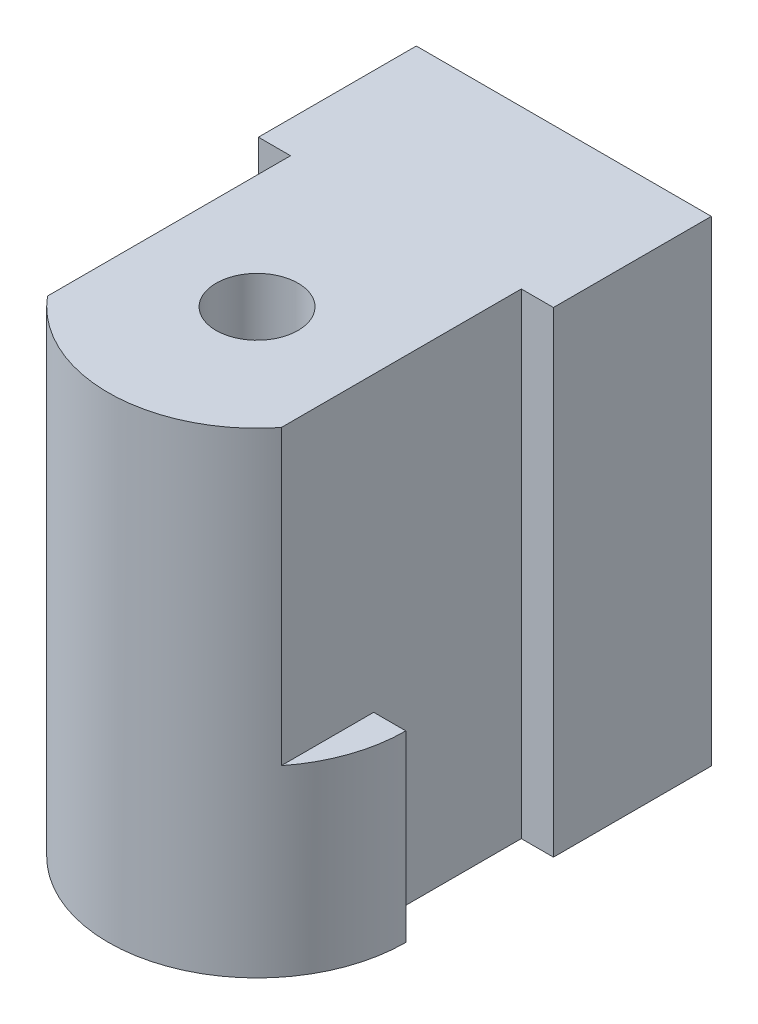
ISO-10303-21;
HEADER;
FILE_DESCRIPTION(('STEP AP214'),'2;1');
FILE_NAME('part.step','',(''),(''),'','','');
FILE_SCHEMA(('AUTOMOTIVE_DESIGN { 1 0 10303 214 1 1 1 1 }'));
ENDSEC;
DATA;
#1=APPLICATION_CONTEXT('core data for automotive mechanical design processes');
#2=APPLICATION_PROTOCOL_DEFINITION('international standard','automotive_design',2000,#1);
#3=PRODUCT_CONTEXT('',#1,'mechanical');
#4=PRODUCT('Part','Part','',(#3));
#5=PRODUCT_RELATED_PRODUCT_CATEGORY('part','',(#4));
#6=PRODUCT_DEFINITION_FORMATION('','',#4);
#7=PRODUCT_DEFINITION_CONTEXT('part definition',#1,'design');
#8=PRODUCT_DEFINITION('design','',#6,#7);
#9=PRODUCT_DEFINITION_SHAPE('','',#8);
#10=(LENGTH_UNIT() NAMED_UNIT(*) SI_UNIT(.MILLI.,.METRE.));
#11=(NAMED_UNIT(*) PLANE_ANGLE_UNIT() SI_UNIT($,.RADIAN.));
#12=(NAMED_UNIT(*) SI_UNIT($,.STERADIAN.) SOLID_ANGLE_UNIT());
#13=UNCERTAINTY_MEASURE_WITH_UNIT(LENGTH_MEASURE(1.E-05),#10,'distance_accuracy_value','');
#14=(GEOMETRIC_REPRESENTATION_CONTEXT(3) GLOBAL_UNCERTAINTY_ASSIGNED_CONTEXT((#13)) GLOBAL_UNIT_ASSIGNED_CONTEXT((#10,
#11,#12)) REPRESENTATION_CONTEXT('',''));
#15=CARTESIAN_POINT('',(0.,0.,0.));
#16=DIRECTION('',(0.,0.,1.));
#17=DIRECTION('',(1.,0.,0.));
#18=AXIS2_PLACEMENT_3D('',#15,#16,#17);
#19=CARTESIAN_POINT('',(-53.6939675410073,-2070.74992623645,-163.840329353942));
#20=DIRECTION('',(0.,-1.,0.));
#21=DIRECTION('',(1.,0.,0.));
#22=AXIS2_PLACEMENT_3D('',#19,#20,#21);
#23=CYLINDRICAL_SURFACE('',#22,12.7);
#24=CARTESIAN_POINT('',(-53.6939675410073,-2070.74992623645,-163.840329353942));
#25=DIRECTION('',(0.,1.,0.));
#26=DIRECTION('',(-1.,0.,0.));
#27=AXIS2_PLACEMENT_3D('',#24,#25,#26);
#28=CIRCLE('',#27,12.7);
#29=CARTESIAN_POINT('',(-63.4359075539626,-2070.74992623645,-155.692654545509));
#30=VERTEX_POINT('',#29);
#31=CARTESIAN_POINT('',(-43.7377214399227,-2070.74992623645,-155.955967390243));
#32=VERTEX_POINT('',#31);
#33=EDGE_CURVE('E285',#30,#32,#28,.T.);
#34=ORIENTED_EDGE('',*,*,#33,.F.);
#35=DIRECTION('',(0.,-1.,0.));
#36=VECTOR('',#35,1.);
#37=CARTESIAN_POINT('',(-63.4359075539626,-2070.74992623645,-155.692654545509));
#38=LINE('',#37,#36);
#39=CARTESIAN_POINT('',(-63.4359075539626,-2095.74992623645,-155.692654545509));
#40=VERTEX_POINT('',#39);
#41=EDGE_CURVE('E181',#30,#40,#38,.T.);
#42=ORIENTED_EDGE('',*,*,#41,.T.);
#43=CARTESIAN_POINT('',(-53.6939675410073,-2095.74992623645,-163.840329353942));
#44=DIRECTION('',(0.,1.,0.));
#45=DIRECTION('',(0.,0.,1.));
#46=AXIS2_PLACEMENT_3D('',#43,#44,#45);
#47=CIRCLE('',#46,12.7);
#48=CARTESIAN_POINT('',(-66.179661452878,-2095.74992623645,-166.163570094605));
#49=VERTEX_POINT('',#48);
#50=EDGE_CURVE('E177',#49,#40,#47,.T.);
#51=ORIENTED_EDGE('',*,*,#50,.F.);
#52=DIRECTION('',(0.,-1.,0.));
#53=VECTOR('',#52,1.);
#54=CARTESIAN_POINT('',(-66.179661452878,-2101.38992623645,-166.163570094605));
#55=LINE('',#54,#53);
#56=CARTESIAN_POINT('',(-66.179661452878,-2111.38992623645,-166.163570094605));
#57=VERTEX_POINT('',#56);
#58=EDGE_CURVE('E255',#49,#57,#55,.T.);
#59=ORIENTED_EDGE('',*,*,#58,.T.);
#60=CARTESIAN_POINT('',(-53.6939675410073,-2111.38992623645,-163.840329353942));
#61=DIRECTION('',(0.,1.,0.));
#62=DIRECTION('',(-1.,0.,0.));
#63=AXIS2_PLACEMENT_3D('',#60,#61,#62);
#64=CIRCLE('',#63,12.7);
#65=CARTESIAN_POINT('',(-40.9939675410073,-2111.38992623645,-163.840329353942));
#66=VERTEX_POINT('',#65);
#67=EDGE_CURVE('E284',#57,#66,#64,.T.);
#68=ORIENTED_EDGE('',*,*,#67,.T.);
#69=DIRECTION('',(0.,-1.,0.));
#70=VECTOR('',#69,1.);
#71=CARTESIAN_POINT('',(-40.9939675410073,-2101.38992623645,-163.840329353942));
#72=LINE('',#71,#70);
#73=CARTESIAN_POINT('',(-40.9939675410073,-2095.74992623645,-163.840329353942));
#74=VERTEX_POINT('',#73);
#75=EDGE_CURVE('E256',#74,#66,#72,.T.);
#76=ORIENTED_EDGE('',*,*,#75,.F.);
#77=CARTESIAN_POINT('',(-53.6939675410073,-2095.74992623645,-163.840329353942));
#78=DIRECTION('',(0.,-1.,0.));
#79=DIRECTION('',(0.,0.,-1.));
#80=AXIS2_PLACEMENT_3D('',#77,#78,#79);
#81=CIRCLE('',#80,12.7);
#82=CARTESIAN_POINT('',(-43.7377214399227,-2095.74992623645,-155.955967390243));
#83=VERTEX_POINT('',#82);
#84=EDGE_CURVE('E157',#74,#83,#81,.T.);
#85=ORIENTED_EDGE('',*,*,#84,.T.);
#86=DIRECTION('',(0.,-1.,0.));
#87=VECTOR('',#86,1.);
#88=CARTESIAN_POINT('',(-43.7377214399227,-2070.74992623645,-155.955967390243));
#89=LINE('',#88,#87);
#90=EDGE_CURVE('E162',#83,#32,#89,.F.);
#91=ORIENTED_EDGE('',*,*,#90,.T.);
#92=EDGE_LOOP('',(#34,#42,#51,#59,#68,#76,#85,#91));
#93=FACE_BOUND('',#92,.T.);
#94=ADVANCED_FACE('F33',(#93),#23,.T.);
#95=CARTESIAN_POINT('',(-53.6939675410073,-2070.74992623645,-163.840329353942));
#96=DIRECTION('',(0.,1.,0.));
#97=DIRECTION('',(-1.,0.,0.));
#98=AXIS2_PLACEMENT_3D('',#95,#96,#97);
#99=PLANE('',#98);
#100=DIRECTION('',(-1.,0.,0.));
#101=VECTOR('',#100,1.);
#102=CARTESIAN_POINT('',(-67.2059024117488,-2070.74992623645,-176.440329353942));
#103=LINE('',#102,#101);
#104=CARTESIAN_POINT('',(-63.4359075539626,-2070.74992623645,-176.440329353942));
#105=VERTEX_POINT('',#104);
#106=CARTESIAN_POINT('',(-66.179661452878,-2070.74992623645,-176.440329353942));
#107=VERTEX_POINT('',#106);
#108=EDGE_CURVE('E296',#105,#107,#103,.T.);
#109=ORIENTED_EDGE('',*,*,#108,.F.);
#110=DIRECTION('',(0.,0.,-1.));
#111=VECTOR('',#110,1.);
#112=CARTESIAN_POINT('',(-63.4359075539626,-2070.74992623645,-176.440329353942));
#113=LINE('',#112,#111);
#114=EDGE_CURVE('E167',#30,#105,#113,.T.);
#115=ORIENTED_EDGE('',*,*,#114,.F.);
#116=ORIENTED_EDGE('',*,*,#33,.T.);
#117=DIRECTION('',(0.,0.,1.));
#118=VECTOR('',#117,1.);
#119=CARTESIAN_POINT('',(-43.7377214399227,-2070.74992623645,-176.440329353942));
#120=LINE('',#119,#118);
#121=CARTESIAN_POINT('',(-43.7377214399227,-2070.74992623645,-176.440329353942));
#122=VERTEX_POINT('',#121);
#123=EDGE_CURVE('E164',#122,#32,#120,.T.);
#124=ORIENTED_EDGE('',*,*,#123,.F.);
#125=DIRECTION('',(-1.,0.,0.));
#126=VECTOR('',#125,1.);
#127=CARTESIAN_POINT('',(-39.9677265821365,-2070.74992623645,-176.440329353942));
#128=LINE('',#127,#126);
#129=CARTESIAN_POINT('',(-40.9939675410073,-2070.74992623645,-176.440329353942));
#130=VERTEX_POINT('',#129);
#131=EDGE_CURVE('E169',#130,#122,#128,.T.);
#132=ORIENTED_EDGE('',*,*,#131,.F.);
#133=DIRECTION('',(0.,0.,-1.));
#134=VECTOR('',#133,1.);
#135=CARTESIAN_POINT('',(-40.9939675410073,-2070.74992623645,-163.840329353942));
#136=LINE('',#135,#134);
#137=CARTESIAN_POINT('',(-40.9939675410073,-2070.74992623645,-189.919076926774));
#138=VERTEX_POINT('',#137);
#139=EDGE_CURVE('E238',#130,#138,#136,.T.);
#140=ORIENTED_EDGE('',*,*,#139,.T.);
#141=DIRECTION('',(-1.,0.,0.));
#142=VECTOR('',#141,1.);
#143=CARTESIAN_POINT('',(-66.179661452878,-2070.74992623645,-189.919076926774));
#144=LINE('',#143,#142);
#145=CARTESIAN_POINT('',(-66.179661452878,-2070.74992623645,-189.919076926774));
#146=VERTEX_POINT('',#145);
#147=EDGE_CURVE('E243',#138,#146,#144,.T.);
#148=ORIENTED_EDGE('',*,*,#147,.T.);
#149=DIRECTION('',(0.,0.,1.));
#150=VECTOR('',#149,1.);
#151=CARTESIAN_POINT('',(-66.179661452878,-2070.74992623645,-163.840329353942));
#152=LINE('',#151,#150);
#153=EDGE_CURVE('E239',#146,#107,#152,.T.);
#154=ORIENTED_EDGE('',*,*,#153,.T.);
#155=EDGE_LOOP('',(#109,#115,#116,#124,#132,#140,#148,#154));
#156=FACE_BOUND('',#155,.T.);
#157=CARTESIAN_POINT('',(-53.6939675410073,-2070.74992623645,-163.840329353942));
#158=DIRECTION('',(0.,1.,0.));
#159=DIRECTION('',(0.,0.,1.));
#160=AXIS2_PLACEMENT_3D('',#157,#158,#159);
#161=CIRCLE('',#160,3.5);
#162=CARTESIAN_POINT('',(-53.6939675410073,-2070.74992623645,-160.340329353942));
#163=VERTEX_POINT('',#162);
#164=EDGE_CURVE('E264',#163,#163,#161,.T.);
#165=ORIENTED_EDGE('',*,*,#164,.F.);
#166=EDGE_LOOP('',(#165));
#167=FACE_BOUND('',#166,.T.);
#168=ADVANCED_FACE('F310',(#156,#167),#99,.T.);
#169=CARTESIAN_POINT('',(-53.6939675410073,-2111.38992623645,-163.840329353942));
#170=DIRECTION('',(0.,1.,0.));
#171=DIRECTION('',(-1.,0.,0.));
#172=AXIS2_PLACEMENT_3D('',#169,#170,#171);
#173=PLANE('',#172);
#174=CARTESIAN_POINT('',(-61.9428595120541,-2111.38992623645,-159.077829353942));
#175=DIRECTION('',(0.,-1.,0.));
#176=DIRECTION('',(0.,0.,-1.));
#177=AXIS2_PLACEMENT_3D('',#174,#175,#176);
#178=CIRCLE('',#177,1.77799999999999);
#179=CARTESIAN_POINT('',(-61.9428595120541,-2111.38992623645,-160.855829353942));
#180=VERTEX_POINT('',#179);
#181=EDGE_CURVE('E265',#180,#180,#178,.T.);
#182=ORIENTED_EDGE('',*,*,#181,.F.);
#183=EDGE_LOOP('',(#182));
#184=FACE_BOUND('',#183,.T.);
#185=CARTESIAN_POINT('',(-53.6939675410073,-2111.38992623645,-173.365329353942));
#186=DIRECTION('',(0.,-1.,0.));
#187=DIRECTION('',(0.,0.,-1.));
#188=AXIS2_PLACEMENT_3D('',#185,#186,#187);
#189=CIRCLE('',#188,1.778);
#190=CARTESIAN_POINT('',(-53.6939675410073,-2111.38992623645,-175.143329353942));
#191=VERTEX_POINT('',#190);
#192=EDGE_CURVE('E271',#191,#191,#189,.T.);
#193=ORIENTED_EDGE('',*,*,#192,.F.);
#194=EDGE_LOOP('',(#193));
#195=FACE_BOUND('',#194,.T.);
#196=CARTESIAN_POINT('',(-45.4450755699605,-2111.38992623645,-159.077829353942));
#197=DIRECTION('',(0.,-1.,0.));
#198=DIRECTION('',(0.,0.,-1.));
#199=AXIS2_PLACEMENT_3D('',#196,#197,#198);
#200=CIRCLE('',#199,1.77799999999999);
#201=CARTESIAN_POINT('',(-45.4450755699605,-2111.38992623645,-160.855829353942));
#202=VERTEX_POINT('',#201);
#203=EDGE_CURVE('E258',#202,#202,#200,.T.);
#204=ORIENTED_EDGE('',*,*,#203,.F.);
#205=EDGE_LOOP('',(#204));
#206=FACE_BOUND('',#205,.T.);
#207=CARTESIAN_POINT('',(-53.6939675410073,-2111.38992623645,-163.840329353942));
#208=DIRECTION('',(0.,1.,0.));
#209=DIRECTION('',(-1.,0.,0.));
#210=AXIS2_PLACEMENT_3D('',#207,#208,#209);
#211=CIRCLE('',#210,3.5);
#212=CARTESIAN_POINT('',(-57.1939675410073,-2111.38992623645,-163.840329353942));
#213=VERTEX_POINT('',#212);
#214=EDGE_CURVE('E281',#213,#213,#211,.F.);
#215=ORIENTED_EDGE('',*,*,#214,.F.);
#216=EDGE_LOOP('',(#215));
#217=FACE_BOUND('',#216,.T.);
#218=DIRECTION('',(0.,0.,-1.));
#219=VECTOR('',#218,1.);
#220=CARTESIAN_POINT('',(-43.7377214399226,-2111.38992623645,-176.440329353942));
#221=LINE('',#220,#219);
#222=CARTESIAN_POINT('',(-43.7377214399226,-2111.38992623645,-163.840329353942));
#223=VERTEX_POINT('',#222);
#224=CARTESIAN_POINT('',(-43.7377214399226,-2111.38992623645,-176.440329353942));
#225=VERTEX_POINT('',#224);
#226=EDGE_CURVE('E319',#223,#225,#221,.T.);
#227=ORIENTED_EDGE('',*,*,#226,.F.);
#228=DIRECTION('',(1.,0.,0.));
#229=VECTOR('',#228,1.);
#230=CARTESIAN_POINT('',(-63.8217847738199,-2111.38992623645,-163.840329353942));
#231=LINE('',#230,#229);
#232=EDGE_CURVE('E146',#223,#66,#231,.T.);
#233=ORIENTED_EDGE('',*,*,#232,.T.);
#234=ORIENTED_EDGE('',*,*,#67,.F.);
#235=DIRECTION('',(-1.,0.,0.));
#236=VECTOR('',#235,1.);
#237=CARTESIAN_POINT('',(-44.7217049026508,-2111.38992623645,-166.163570094605));
#238=LINE('',#237,#236);
#239=CARTESIAN_POINT('',(-63.4359075539626,-2111.38992623645,-166.163570094605));
#240=VERTEX_POINT('',#239);
#241=EDGE_CURVE('E322',#240,#57,#238,.T.);
#242=ORIENTED_EDGE('',*,*,#241,.F.);
#243=DIRECTION('',(0.,0.,1.));
#244=VECTOR('',#243,1.);
#245=CARTESIAN_POINT('',(-63.4359075539626,-2111.38992623645,-176.440329353942));
#246=LINE('',#245,#244);
#247=CARTESIAN_POINT('',(-63.4359075539626,-2111.38992623645,-176.440329353942));
#248=VERTEX_POINT('',#247);
#249=EDGE_CURVE('E302',#248,#240,#246,.T.);
#250=ORIENTED_EDGE('',*,*,#249,.F.);
#251=DIRECTION('',(-1.,0.,0.));
#252=VECTOR('',#251,1.);
#253=CARTESIAN_POINT('',(-44.7217049026508,-2111.38992623645,-176.440329353942));
#254=LINE('',#253,#252);
#255=CARTESIAN_POINT('',(-66.179661452878,-2111.38992623645,-176.440329353942));
#256=VERTEX_POINT('',#255);
#257=EDGE_CURVE('E175',#248,#256,#254,.T.);
#258=ORIENTED_EDGE('',*,*,#257,.T.);
#259=DIRECTION('',(0.,0.,-1.));
#260=VECTOR('',#259,1.);
#261=CARTESIAN_POINT('',(-66.179661452878,-2111.38992623645,-166.163570094605));
#262=LINE('',#261,#260);
#263=CARTESIAN_POINT('',(-66.179661452878,-2111.38992623645,-189.919076926775));
#264=VERTEX_POINT('',#263);
#265=EDGE_CURVE('E47',#256,#264,#262,.T.);
#266=ORIENTED_EDGE('',*,*,#265,.T.);
#267=DIRECTION('',(1.,0.,0.));
#268=VECTOR('',#267,1.);
#269=CARTESIAN_POINT('',(-40.9939675410073,-2111.38992623645,-189.919076926775));
#270=LINE('',#269,#268);
#271=CARTESIAN_POINT('',(-40.9939675410073,-2111.38992623645,-189.919076926775));
#272=VERTEX_POINT('',#271);
#273=EDGE_CURVE('E249',#264,#272,#270,.T.);
#274=ORIENTED_EDGE('',*,*,#273,.T.);
#275=DIRECTION('',(0.,0.,1.));
#276=VECTOR('',#275,1.);
#277=CARTESIAN_POINT('',(-40.9939675410073,-2111.38992623645,-163.840329353942));
#278=LINE('',#277,#276);
#279=CARTESIAN_POINT('',(-40.9939675410073,-2111.38992623645,-176.440329353942));
#280=VERTEX_POINT('',#279);
#281=EDGE_CURVE('E55',#272,#280,#278,.T.);
#282=ORIENTED_EDGE('',*,*,#281,.T.);
#283=DIRECTION('',(1.,0.,0.));
#284=VECTOR('',#283,1.);
#285=CARTESIAN_POINT('',(-63.8217847738199,-2111.38992623645,-176.440329353942));
#286=LINE('',#285,#284);
#287=EDGE_CURVE('E318',#225,#280,#286,.T.);
#288=ORIENTED_EDGE('',*,*,#287,.F.);
#289=EDGE_LOOP('',(#227,#233,#234,#242,#250,#258,#266,#274,#282,#288));
#290=FACE_BOUND('',#289,.T.);
#291=ADVANCED_FACE('F299',(#184,#195,#206,#217,#290),#173,.F.);
#292=CARTESIAN_POINT('',(-53.6939675410073,-2121.28942117306,-163.840329353942));
#293=DIRECTION('',(0.,1.,0.));
#294=DIRECTION('',(0.,0.,1.));
#295=AXIS2_PLACEMENT_3D('',#292,#293,#294);
#296=CYLINDRICAL_SURFACE('',#295,3.5);
#297=ORIENTED_EDGE('',*,*,#214,.T.);
#298=EDGE_LOOP('',(#297));
#299=FACE_BOUND('',#298,.T.);
#300=ORIENTED_EDGE('',*,*,#164,.T.);
#301=EDGE_LOOP('',(#300));
#302=FACE_BOUND('',#301,.T.);
#303=ADVANCED_FACE('F371',(#299,#302),#296,.F.);
#304=CARTESIAN_POINT('',(-45.4450755699605,-2105.38992623645,-159.077829353942));
#305=DIRECTION('',(0.,-1.,0.));
#306=DIRECTION('',(0.,0.,-1.));
#307=AXIS2_PLACEMENT_3D('',#304,#305,#306);
#308=CYLINDRICAL_SURFACE('',#307,1.77799999999999);
#309=CARTESIAN_POINT('',(-45.4450755699605,-2105.38992623645,-159.077829353942));
#310=DIRECTION('',(0.,-1.,0.));
#311=DIRECTION('',(0.,0.,-1.));
#312=AXIS2_PLACEMENT_3D('',#309,#310,#311);
#313=CIRCLE('',#312,1.77799999999999);
#314=CARTESIAN_POINT('',(-45.4450755699605,-2105.38992623645,-160.855829353942));
#315=VERTEX_POINT('',#314);
#316=EDGE_CURVE('E274',#315,#315,#313,.T.);
#317=ORIENTED_EDGE('',*,*,#316,.F.);
#318=EDGE_LOOP('',(#317));
#319=FACE_BOUND('',#318,.T.);
#320=ORIENTED_EDGE('',*,*,#203,.T.);
#321=EDGE_LOOP('',(#320));
#322=FACE_BOUND('',#321,.T.);
#323=ADVANCED_FACE('F376',(#319,#322),#308,.F.);
#324=CARTESIAN_POINT('',(-45.4450755699605,-2105.38992623645,-159.077829353942));
#325=DIRECTION('',(0.,-1.,0.));
#326=DIRECTION('',(0.,0.,-1.));
#327=AXIS2_PLACEMENT_3D('',#324,#325,#326);
#328=PLANE('',#327);
#329=ORIENTED_EDGE('',*,*,#316,.T.);
#330=EDGE_LOOP('',(#329));
#331=FACE_BOUND('',#330,.T.);
#332=ADVANCED_FACE('F380',(#331),#328,.T.);
#333=CARTESIAN_POINT('',(-53.6939675410073,-2105.38992623645,-173.365329353942));
#334=DIRECTION('',(0.,-1.,0.));
#335=DIRECTION('',(0.,0.,-1.));
#336=AXIS2_PLACEMENT_3D('',#333,#334,#335);
#337=CYLINDRICAL_SURFACE('',#336,1.778);
#338=CARTESIAN_POINT('',(-53.6939675410073,-2105.38992623645,-173.365329353942));
#339=DIRECTION('',(0.,-1.,0.));
#340=DIRECTION('',(0.,0.,-1.));
#341=AXIS2_PLACEMENT_3D('',#338,#339,#340);
#342=CIRCLE('',#341,1.778);
#343=CARTESIAN_POINT('',(-53.6939675410073,-2105.38992623645,-175.143329353942));
#344=VERTEX_POINT('',#343);
#345=EDGE_CURVE('E268',#344,#344,#342,.T.);
#346=ORIENTED_EDGE('',*,*,#345,.F.);
#347=EDGE_LOOP('',(#346));
#348=FACE_BOUND('',#347,.T.);
#349=ORIENTED_EDGE('',*,*,#192,.T.);
#350=EDGE_LOOP('',(#349));
#351=FACE_BOUND('',#350,.T.);
#352=ADVANCED_FACE('F384',(#348,#351),#337,.F.);
#353=CARTESIAN_POINT('',(-53.6939675410073,-2105.38992623645,-173.365329353942));
#354=DIRECTION('',(0.,-1.,0.));
#355=DIRECTION('',(0.,0.,-1.));
#356=AXIS2_PLACEMENT_3D('',#353,#354,#355);
#357=PLANE('',#356);
#358=ORIENTED_EDGE('',*,*,#345,.T.);
#359=EDGE_LOOP('',(#358));
#360=FACE_BOUND('',#359,.T.);
#361=ADVANCED_FACE('F388',(#360),#357,.T.);
#362=CARTESIAN_POINT('',(-61.9428595120541,-2105.38992623645,-159.077829353942));
#363=DIRECTION('',(0.,-1.,0.));
#364=DIRECTION('',(0.,0.,-1.));
#365=AXIS2_PLACEMENT_3D('',#362,#363,#364);
#366=CYLINDRICAL_SURFACE('',#365,1.77799999999999);
#367=CARTESIAN_POINT('',(-61.9428595120541,-2105.38992623645,-159.077829353942));
#368=DIRECTION('',(0.,-1.,0.));
#369=DIRECTION('',(0.,0.,-1.));
#370=AXIS2_PLACEMENT_3D('',#367,#368,#369);
#371=CIRCLE('',#370,1.77799999999999);
#372=CARTESIAN_POINT('',(-61.9428595120541,-2105.38992623645,-160.855829353942));
#373=VERTEX_POINT('',#372);
#374=EDGE_CURVE('E261',#373,#373,#371,.T.);
#375=ORIENTED_EDGE('',*,*,#374,.F.);
#376=EDGE_LOOP('',(#375));
#377=FACE_BOUND('',#376,.T.);
#378=ORIENTED_EDGE('',*,*,#181,.T.);
#379=EDGE_LOOP('',(#378));
#380=FACE_BOUND('',#379,.T.);
#381=ADVANCED_FACE('F392',(#377,#380),#366,.F.);
#382=CARTESIAN_POINT('',(-61.9428595120541,-2105.38992623645,-159.077829353942));
#383=DIRECTION('',(0.,-1.,0.));
#384=DIRECTION('',(0.,0.,-1.));
#385=AXIS2_PLACEMENT_3D('',#382,#383,#384);
#386=PLANE('',#385);
#387=ORIENTED_EDGE('',*,*,#374,.T.);
#388=EDGE_LOOP('',(#387));
#389=FACE_BOUND('',#388,.T.);
#390=ADVANCED_FACE('F396',(#389),#386,.T.);
#391=CARTESIAN_POINT('',(-40.9939675410073,-2101.38992623645,-163.840329353942));
#392=DIRECTION('',(1.,0.,0.));
#393=DIRECTION('',(0.,1.,0.));
#394=AXIS2_PLACEMENT_3D('',#391,#392,#393);
#395=PLANE('',#394);
#396=DIRECTION('',(0.,1.,0.));
#397=VECTOR('',#396,1.);
#398=CARTESIAN_POINT('',(-40.9939675410073,-2101.38992623645,-176.440329353942));
#399=LINE('',#398,#397);
#400=EDGE_CURVE('E11',#280,#130,#399,.T.);
#401=ORIENTED_EDGE('',*,*,#400,.F.);
#402=ORIENTED_EDGE('',*,*,#281,.F.);
#403=DIRECTION('',(0.,1.,0.));
#404=VECTOR('',#403,1.);
#405=CARTESIAN_POINT('',(-40.9939675410073,-2101.38992623645,-189.919076926775));
#406=LINE('',#405,#404);
#407=EDGE_CURVE('E251',#272,#138,#406,.T.);
#408=ORIENTED_EDGE('',*,*,#407,.T.);
#409=ORIENTED_EDGE('',*,*,#139,.F.);
#410=EDGE_LOOP('',(#401,#402,#408,#409));
#411=FACE_BOUND('',#410,.T.);
#412=ADVANCED_FACE('F315',(#411),#395,.T.);
#413=CARTESIAN_POINT('',(-66.179661452878,-2101.38992623645,-166.163570094605));
#414=DIRECTION('',(-1.,0.,0.));
#415=DIRECTION('',(0.,-1.,0.));
#416=AXIS2_PLACEMENT_3D('',#413,#414,#415);
#417=PLANE('',#416);
#418=ORIENTED_EDGE('',*,*,#265,.F.);
#419=DIRECTION('',(0.,-1.,0.));
#420=VECTOR('',#419,1.);
#421=CARTESIAN_POINT('',(-66.179661452878,-2101.38992623645,-176.440329353942));
#422=LINE('',#421,#420);
#423=EDGE_CURVE('E40',#107,#256,#422,.T.);
#424=ORIENTED_EDGE('',*,*,#423,.F.);
#425=ORIENTED_EDGE('',*,*,#153,.F.);
#426=DIRECTION('',(0.,-1.,0.));
#427=VECTOR('',#426,1.);
#428=CARTESIAN_POINT('',(-66.179661452878,-2101.38992623645,-189.919076926775));
#429=LINE('',#428,#427);
#430=EDGE_CURVE('E242',#146,#264,#429,.T.);
#431=ORIENTED_EDGE('',*,*,#430,.T.);
#432=EDGE_LOOP('',(#418,#424,#425,#431));
#433=FACE_BOUND('',#432,.T.);
#434=ADVANCED_FACE('F305',(#433),#417,.T.);
#435=CARTESIAN_POINT('',(399.459604492078,-1664.88134965421,-189.919076926775));
#436=DIRECTION('',(0.,0.,1.));
#437=DIRECTION('',(-0.9999980793749,-0.00195990982184696,0.));
#438=AXIS2_PLACEMENT_3D('',#435,#436,#437);
#439=PLANE('',#438);
#440=CARTESIAN_POINT('',(-53.586814498129,-2106.38992623204,-189.919076926774));
#441=DIRECTION('',(0.,0.,-1.));
#442=DIRECTION('',(0.,1.,0.));
#443=AXIS2_PLACEMENT_3D('',#440,#441,#442);
#444=CIRCLE('',#443,3.15);
#445=CARTESIAN_POINT('',(-53.586814498129,-2103.23992623204,-189.919076926774));
#446=VERTEX_POINT('',#445);
#447=EDGE_CURVE('E184',#446,#446,#444,.T.);
#448=ORIENTED_EDGE('',*,*,#447,.F.);
#449=EDGE_LOOP('',(#448));
#450=FACE_BOUND('',#449,.T.);
#451=CARTESIAN_POINT('',(-62.6263575121822,-2106.38992623204,-189.919076926774));
#452=DIRECTION('',(0.,0.,-1.));
#453=DIRECTION('',(0.,1.,0.));
#454=AXIS2_PLACEMENT_3D('',#451,#452,#453);
#455=CIRCLE('',#454,3.15);
#456=CARTESIAN_POINT('',(-62.6263575121822,-2103.23992623204,-189.919076926774));
#457=VERTEX_POINT('',#456);
#458=EDGE_CURVE('E193',#457,#457,#455,.T.);
#459=ORIENTED_EDGE('',*,*,#458,.F.);
#460=EDGE_LOOP('',(#459));
#461=FACE_BOUND('',#460,.T.);
#462=CARTESIAN_POINT('',(-44.5472714840758,-2106.38992623204,-189.919076926774));
#463=DIRECTION('',(0.,0.,-1.));
#464=DIRECTION('',(0.,1.,0.));
#465=AXIS2_PLACEMENT_3D('',#462,#463,#464);
#466=CIRCLE('',#465,3.15);
#467=CARTESIAN_POINT('',(-44.5472714840758,-2103.23992623204,-189.919076926774));
#468=VERTEX_POINT('',#467);
#469=EDGE_CURVE('E202',#468,#468,#466,.T.);
#470=ORIENTED_EDGE('',*,*,#469,.F.);
#471=EDGE_LOOP('',(#470));
#472=FACE_BOUND('',#471,.T.);
#473=CARTESIAN_POINT('',(-53.586814498129,-2075.74992623645,-189.919076926774));
#474=DIRECTION('',(0.,0.,-1.));
#475=DIRECTION('',(0.,1.,0.));
#476=AXIS2_PLACEMENT_3D('',#473,#474,#475);
#477=CIRCLE('',#476,3.15);
#478=CARTESIAN_POINT('',(-53.586814498129,-2072.59992623645,-189.919076926774));
#479=VERTEX_POINT('',#478);
#480=EDGE_CURVE('E211',#479,#479,#477,.T.);
#481=ORIENTED_EDGE('',*,*,#480,.F.);
#482=EDGE_LOOP('',(#481));
#483=FACE_BOUND('',#482,.T.);
#484=CARTESIAN_POINT('',(-62.6263575121823,-2075.74992623645,-189.919076926774));
#485=DIRECTION('',(0.,0.,-1.));
#486=DIRECTION('',(0.,1.,0.));
#487=AXIS2_PLACEMENT_3D('',#484,#485,#486);
#488=CIRCLE('',#487,3.15);
#489=CARTESIAN_POINT('',(-62.6263575121823,-2072.59992623645,-189.919076926774));
#490=VERTEX_POINT('',#489);
#491=EDGE_CURVE('E220',#490,#490,#488,.T.);
#492=ORIENTED_EDGE('',*,*,#491,.F.);
#493=EDGE_LOOP('',(#492));
#494=FACE_BOUND('',#493,.T.);
#495=CARTESIAN_POINT('',(-44.5472714840758,-2075.74992623645,-189.919076926774));
#496=DIRECTION('',(0.,0.,-1.));
#497=DIRECTION('',(0.,1.,0.));
#498=AXIS2_PLACEMENT_3D('',#495,#496,#497);
#499=CIRCLE('',#498,3.15);
#500=CARTESIAN_POINT('',(-44.5472714840758,-2072.59992623645,-189.919076926774));
#501=VERTEX_POINT('',#500);
#502=EDGE_CURVE('E229',#501,#501,#499,.T.);
#503=ORIENTED_EDGE('',*,*,#502,.F.);
#504=EDGE_LOOP('',(#503));
#505=FACE_BOUND('',#504,.T.);
#506=ORIENTED_EDGE('',*,*,#273,.F.);
#507=ORIENTED_EDGE('',*,*,#430,.F.);
#508=ORIENTED_EDGE('',*,*,#147,.F.);
#509=ORIENTED_EDGE('',*,*,#407,.F.);
#510=EDGE_LOOP('',(#506,#507,#508,#509));
#511=FACE_BOUND('',#510,.T.);
#512=ADVANCED_FACE('F308',(#450,#461,#472,#483,#494,#505,#511),#439,.F.);
#513=CARTESIAN_POINT('',(-44.5472714840758,-2075.74992623645,-180.940539979121));
#514=DIRECTION('',(0.,0.,-1.));
#515=DIRECTION('',(0.,1.,0.));
#516=AXIS2_PLACEMENT_3D('',#513,#514,#515);
#517=CONICAL_SURFACE('',#516,1.7,1.02974425867666);
#518=CARTESIAN_POINT('',(-44.5472714840758,-2075.74992623645,-179.919076926774));
#519=VERTEX_POINT('',#518);
#520=VERTEX_LOOP('',#519);
#521=FACE_BOUND('',#520,.T.);
#522=CARTESIAN_POINT('',(-44.5472714840758,-2075.74992623645,-180.940539979121));
#523=DIRECTION('',(0.,0.,-1.));
#524=DIRECTION('',(0.,1.,0.));
#525=AXIS2_PLACEMENT_3D('',#522,#523,#524);
#526=CIRCLE('',#525,1.7);
#527=CARTESIAN_POINT('',(-44.5472714840758,-2074.04992623645,-180.940539979121));
#528=VERTEX_POINT('',#527);
#529=EDGE_CURVE('E235',#528,#528,#526,.T.);
#530=ORIENTED_EDGE('',*,*,#529,.T.);
#531=EDGE_LOOP('',(#530));
#532=FACE_BOUND('',#531,.T.);
#533=ADVANCED_FACE('F406',(#521,#532),#517,.F.);
#534=CARTESIAN_POINT('',(-44.5472714840758,-2075.74992623645,-189.919076926774));
#535=DIRECTION('',(0.,0.,-1.));
#536=DIRECTION('',(0.,1.,0.));
#537=AXIS2_PLACEMENT_3D('',#534,#535,#536);
#538=CYLINDRICAL_SURFACE('',#537,1.7);
#539=ORIENTED_EDGE('',*,*,#529,.F.);
#540=EDGE_LOOP('',(#539));
#541=FACE_BOUND('',#540,.T.);
#542=CARTESIAN_POINT('',(-44.5472714840758,-2075.74992623645,-188.469076926774));
#543=DIRECTION('',(0.,0.,-1.));
#544=DIRECTION('',(0.,1.,0.));
#545=AXIS2_PLACEMENT_3D('',#542,#543,#544);
#546=CIRCLE('',#545,1.69999999999999);
#547=CARTESIAN_POINT('',(-44.5472714840758,-2074.04992623645,-188.469076926774));
#548=VERTEX_POINT('',#547);
#549=EDGE_CURVE('E232',#548,#548,#546,.T.);
#550=ORIENTED_EDGE('',*,*,#549,.T.);
#551=EDGE_LOOP('',(#550));
#552=FACE_BOUND('',#551,.T.);
#553=ADVANCED_FACE('F410',(#541,#552),#538,.F.);
#554=CARTESIAN_POINT('',(-44.5472714840758,-2075.74992623645,-189.919076926774));
#555=DIRECTION('',(0.,0.,-1.));
#556=DIRECTION('',(0.,1.,0.));
#557=AXIS2_PLACEMENT_3D('',#554,#555,#556);
#558=CONICAL_SURFACE('',#557,3.15,0.785398163397448);
#559=ORIENTED_EDGE('',*,*,#549,.F.);
#560=EDGE_LOOP('',(#559));
#561=FACE_BOUND('',#560,.T.);
#562=ORIENTED_EDGE('',*,*,#502,.T.);
#563=EDGE_LOOP('',(#562));
#564=FACE_BOUND('',#563,.T.);
#565=ADVANCED_FACE('F414',(#561,#564),#558,.F.);
#566=CARTESIAN_POINT('',(-62.6263575121823,-2075.74992623645,-180.940539979121));
#567=DIRECTION('',(0.,0.,-1.));
#568=DIRECTION('',(0.,1.,0.));
#569=AXIS2_PLACEMENT_3D('',#566,#567,#568);
#570=CONICAL_SURFACE('',#569,1.7,1.02974425867666);
#571=CARTESIAN_POINT('',(-62.6263575121823,-2075.74992623645,-179.919076926774));
#572=VERTEX_POINT('',#571);
#573=VERTEX_LOOP('',#572);
#574=FACE_BOUND('',#573,.T.);
#575=CARTESIAN_POINT('',(-62.6263575121823,-2075.74992623645,-180.940539979121));
#576=DIRECTION('',(0.,0.,-1.));
#577=DIRECTION('',(0.,1.,0.));
#578=AXIS2_PLACEMENT_3D('',#575,#576,#577);
#579=CIRCLE('',#578,1.7);
#580=CARTESIAN_POINT('',(-62.6263575121823,-2074.04992623645,-180.940539979121));
#581=VERTEX_POINT('',#580);
#582=EDGE_CURVE('E226',#581,#581,#579,.T.);
#583=ORIENTED_EDGE('',*,*,#582,.T.);
#584=EDGE_LOOP('',(#583));
#585=FACE_BOUND('',#584,.T.);
#586=ADVANCED_FACE('F418',(#574,#585),#570,.F.);
#587=CARTESIAN_POINT('',(-62.6263575121823,-2075.74992623645,-189.919076926774));
#588=DIRECTION('',(0.,0.,-1.));
#589=DIRECTION('',(0.,1.,0.));
#590=AXIS2_PLACEMENT_3D('',#587,#588,#589);
#591=CYLINDRICAL_SURFACE('',#590,1.7);
#592=ORIENTED_EDGE('',*,*,#582,.F.);
#593=EDGE_LOOP('',(#592));
#594=FACE_BOUND('',#593,.T.);
#595=CARTESIAN_POINT('',(-62.6263575121823,-2075.74992623645,-188.469076926774));
#596=DIRECTION('',(0.,0.,-1.));
#597=DIRECTION('',(0.,1.,0.));
#598=AXIS2_PLACEMENT_3D('',#595,#596,#597);
#599=CIRCLE('',#598,1.69999999999999);
#600=CARTESIAN_POINT('',(-62.6263575121823,-2074.04992623645,-188.469076926774));
#601=VERTEX_POINT('',#600);
#602=EDGE_CURVE('E223',#601,#601,#599,.T.);
#603=ORIENTED_EDGE('',*,*,#602,.T.);
#604=EDGE_LOOP('',(#603));
#605=FACE_BOUND('',#604,.T.);
#606=ADVANCED_FACE('F422',(#594,#605),#591,.F.);
#607=CARTESIAN_POINT('',(-62.6263575121823,-2075.74992623645,-189.919076926774));
#608=DIRECTION('',(0.,0.,-1.));
#609=DIRECTION('',(0.,1.,0.));
#610=AXIS2_PLACEMENT_3D('',#607,#608,#609);
#611=CONICAL_SURFACE('',#610,3.15,0.785398163397448);
#612=ORIENTED_EDGE('',*,*,#602,.F.);
#613=EDGE_LOOP('',(#612));
#614=FACE_BOUND('',#613,.T.);
#615=ORIENTED_EDGE('',*,*,#491,.T.);
#616=EDGE_LOOP('',(#615));
#617=FACE_BOUND('',#616,.T.);
#618=ADVANCED_FACE('F426',(#614,#617),#611,.F.);
#619=CARTESIAN_POINT('',(-53.586814498129,-2075.74992623645,-180.940539979121));
#620=DIRECTION('',(0.,0.,-1.));
#621=DIRECTION('',(0.,1.,0.));
#622=AXIS2_PLACEMENT_3D('',#619,#620,#621);
#623=CONICAL_SURFACE('',#622,1.7,1.02974425867666);
#624=CARTESIAN_POINT('',(-53.586814498129,-2075.74992623645,-179.919076926774));
#625=VERTEX_POINT('',#624);
#626=VERTEX_LOOP('',#625);
#627=FACE_BOUND('',#626,.T.);
#628=CARTESIAN_POINT('',(-53.586814498129,-2075.74992623645,-180.940539979121));
#629=DIRECTION('',(0.,0.,-1.));
#630=DIRECTION('',(0.,1.,0.));
#631=AXIS2_PLACEMENT_3D('',#628,#629,#630);
#632=CIRCLE('',#631,1.7);
#633=CARTESIAN_POINT('',(-53.586814498129,-2074.04992623645,-180.940539979121));
#634=VERTEX_POINT('',#633);
#635=EDGE_CURVE('E217',#634,#634,#632,.T.);
#636=ORIENTED_EDGE('',*,*,#635,.T.);
#637=EDGE_LOOP('',(#636));
#638=FACE_BOUND('',#637,.T.);
#639=ADVANCED_FACE('F430',(#627,#638),#623,.F.);
#640=CARTESIAN_POINT('',(-53.586814498129,-2075.74992623645,-189.919076926774));
#641=DIRECTION('',(0.,0.,-1.));
#642=DIRECTION('',(0.,1.,0.));
#643=AXIS2_PLACEMENT_3D('',#640,#641,#642);
#644=CYLINDRICAL_SURFACE('',#643,1.7);
#645=ORIENTED_EDGE('',*,*,#635,.F.);
#646=EDGE_LOOP('',(#645));
#647=FACE_BOUND('',#646,.T.);
#648=CARTESIAN_POINT('',(-53.586814498129,-2075.74992623645,-188.469076926774));
#649=DIRECTION('',(0.,0.,-1.));
#650=DIRECTION('',(0.,1.,0.));
#651=AXIS2_PLACEMENT_3D('',#648,#649,#650);
#652=CIRCLE('',#651,1.69999999999999);
#653=CARTESIAN_POINT('',(-53.586814498129,-2074.04992623645,-188.469076926774));
#654=VERTEX_POINT('',#653);
#655=EDGE_CURVE('E214',#654,#654,#652,.T.);
#656=ORIENTED_EDGE('',*,*,#655,.T.);
#657=EDGE_LOOP('',(#656));
#658=FACE_BOUND('',#657,.T.);
#659=ADVANCED_FACE('F434',(#647,#658),#644,.F.);
#660=CARTESIAN_POINT('',(-53.586814498129,-2075.74992623645,-189.919076926774));
#661=DIRECTION('',(0.,0.,-1.));
#662=DIRECTION('',(0.,1.,0.));
#663=AXIS2_PLACEMENT_3D('',#660,#661,#662);
#664=CONICAL_SURFACE('',#663,3.15,0.785398163397448);
#665=ORIENTED_EDGE('',*,*,#655,.F.);
#666=EDGE_LOOP('',(#665));
#667=FACE_BOUND('',#666,.T.);
#668=ORIENTED_EDGE('',*,*,#480,.T.);
#669=EDGE_LOOP('',(#668));
#670=FACE_BOUND('',#669,.T.);
#671=ADVANCED_FACE('F438',(#667,#670),#664,.F.);
#672=CARTESIAN_POINT('',(-44.5472714840758,-2106.38992623204,-180.940539979121));
#673=DIRECTION('',(0.,0.,-1.));
#674=DIRECTION('',(0.,1.,0.));
#675=AXIS2_PLACEMENT_3D('',#672,#673,#674);
#676=CONICAL_SURFACE('',#675,1.7,1.02974425867666);
#677=CARTESIAN_POINT('',(-44.5472714840758,-2106.38992623204,-179.919076926774));
#678=VERTEX_POINT('',#677);
#679=VERTEX_LOOP('',#678);
#680=FACE_BOUND('',#679,.T.);
#681=CARTESIAN_POINT('',(-44.5472714840758,-2106.38992623204,-180.940539979121));
#682=DIRECTION('',(0.,0.,-1.));
#683=DIRECTION('',(0.,1.,0.));
#684=AXIS2_PLACEMENT_3D('',#681,#682,#683);
#685=CIRCLE('',#684,1.7);
#686=CARTESIAN_POINT('',(-44.5472714840758,-2104.68992623204,-180.940539979121));
#687=VERTEX_POINT('',#686);
#688=EDGE_CURVE('E208',#687,#687,#685,.T.);
#689=ORIENTED_EDGE('',*,*,#688,.T.);
#690=EDGE_LOOP('',(#689));
#691=FACE_BOUND('',#690,.T.);
#692=ADVANCED_FACE('F442',(#680,#691),#676,.F.);
#693=CARTESIAN_POINT('',(-44.5472714840758,-2106.38992623204,-189.919076926774));
#694=DIRECTION('',(0.,0.,-1.));
#695=DIRECTION('',(0.,1.,0.));
#696=AXIS2_PLACEMENT_3D('',#693,#694,#695);
#697=CYLINDRICAL_SURFACE('',#696,1.7);
#698=ORIENTED_EDGE('',*,*,#688,.F.);
#699=EDGE_LOOP('',(#698));
#700=FACE_BOUND('',#699,.T.);
#701=CARTESIAN_POINT('',(-44.5472714840758,-2106.38992623204,-188.469076926774));
#702=DIRECTION('',(0.,0.,-1.));
#703=DIRECTION('',(0.,1.,0.));
#704=AXIS2_PLACEMENT_3D('',#701,#702,#703);
#705=CIRCLE('',#704,1.69999999999999);
#706=CARTESIAN_POINT('',(-44.5472714840758,-2104.68992623204,-188.469076926774));
#707=VERTEX_POINT('',#706);
#708=EDGE_CURVE('E205',#707,#707,#705,.T.);
#709=ORIENTED_EDGE('',*,*,#708,.T.);
#710=EDGE_LOOP('',(#709));
#711=FACE_BOUND('',#710,.T.);
#712=ADVANCED_FACE('F446',(#700,#711),#697,.F.);
#713=CARTESIAN_POINT('',(-44.5472714840758,-2106.38992623204,-189.919076926774));
#714=DIRECTION('',(0.,0.,-1.));
#715=DIRECTION('',(0.,1.,0.));
#716=AXIS2_PLACEMENT_3D('',#713,#714,#715);
#717=CONICAL_SURFACE('',#716,3.15,0.785398163397448);
#718=ORIENTED_EDGE('',*,*,#708,.F.);
#719=EDGE_LOOP('',(#718));
#720=FACE_BOUND('',#719,.T.);
#721=ORIENTED_EDGE('',*,*,#469,.T.);
#722=EDGE_LOOP('',(#721));
#723=FACE_BOUND('',#722,.T.);
#724=ADVANCED_FACE('F450',(#720,#723),#717,.F.);
#725=CARTESIAN_POINT('',(-62.6263575121822,-2106.38992623204,-180.940539979121));
#726=DIRECTION('',(0.,0.,-1.));
#727=DIRECTION('',(0.,1.,0.));
#728=AXIS2_PLACEMENT_3D('',#725,#726,#727);
#729=CONICAL_SURFACE('',#728,1.7,1.02974425867666);
#730=CARTESIAN_POINT('',(-62.6263575121822,-2106.38992623204,-179.919076926774));
#731=VERTEX_POINT('',#730);
#732=VERTEX_LOOP('',#731);
#733=FACE_BOUND('',#732,.T.);
#734=CARTESIAN_POINT('',(-62.6263575121822,-2106.38992623204,-180.940539979121));
#735=DIRECTION('',(0.,0.,-1.));
#736=DIRECTION('',(0.,1.,0.));
#737=AXIS2_PLACEMENT_3D('',#734,#735,#736);
#738=CIRCLE('',#737,1.7);
#739=CARTESIAN_POINT('',(-62.6263575121822,-2104.68992623204,-180.940539979121));
#740=VERTEX_POINT('',#739);
#741=EDGE_CURVE('E199',#740,#740,#738,.T.);
#742=ORIENTED_EDGE('',*,*,#741,.T.);
#743=EDGE_LOOP('',(#742));
#744=FACE_BOUND('',#743,.T.);
#745=ADVANCED_FACE('F454',(#733,#744),#729,.F.);
#746=CARTESIAN_POINT('',(-62.6263575121822,-2106.38992623204,-189.919076926774));
#747=DIRECTION('',(0.,0.,-1.));
#748=DIRECTION('',(0.,1.,0.));
#749=AXIS2_PLACEMENT_3D('',#746,#747,#748);
#750=CYLINDRICAL_SURFACE('',#749,1.7);
#751=ORIENTED_EDGE('',*,*,#741,.F.);
#752=EDGE_LOOP('',(#751));
#753=FACE_BOUND('',#752,.T.);
#754=CARTESIAN_POINT('',(-62.6263575121822,-2106.38992623204,-188.469076926774));
#755=DIRECTION('',(0.,0.,-1.));
#756=DIRECTION('',(0.,1.,0.));
#757=AXIS2_PLACEMENT_3D('',#754,#755,#756);
#758=CIRCLE('',#757,1.69999999999999);
#759=CARTESIAN_POINT('',(-62.6263575121822,-2104.68992623204,-188.469076926774));
#760=VERTEX_POINT('',#759);
#761=EDGE_CURVE('E196',#760,#760,#758,.T.);
#762=ORIENTED_EDGE('',*,*,#761,.T.);
#763=EDGE_LOOP('',(#762));
#764=FACE_BOUND('',#763,.T.);
#765=ADVANCED_FACE('F458',(#753,#764),#750,.F.);
#766=CARTESIAN_POINT('',(-62.6263575121822,-2106.38992623204,-189.919076926774));
#767=DIRECTION('',(0.,0.,-1.));
#768=DIRECTION('',(0.,1.,0.));
#769=AXIS2_PLACEMENT_3D('',#766,#767,#768);
#770=CONICAL_SURFACE('',#769,3.15,0.785398163397448);
#771=ORIENTED_EDGE('',*,*,#761,.F.);
#772=EDGE_LOOP('',(#771));
#773=FACE_BOUND('',#772,.T.);
#774=ORIENTED_EDGE('',*,*,#458,.T.);
#775=EDGE_LOOP('',(#774));
#776=FACE_BOUND('',#775,.T.);
#777=ADVANCED_FACE('F462',(#773,#776),#770,.F.);
#778=CARTESIAN_POINT('',(-53.586814498129,-2106.38992623204,-180.940539979121));
#779=DIRECTION('',(0.,0.,-1.));
#780=DIRECTION('',(0.,1.,0.));
#781=AXIS2_PLACEMENT_3D('',#778,#779,#780);
#782=CONICAL_SURFACE('',#781,1.7,1.02974425867666);
#783=CARTESIAN_POINT('',(-53.586814498129,-2106.38992623204,-179.919076926774));
#784=VERTEX_POINT('',#783);
#785=VERTEX_LOOP('',#784);
#786=FACE_BOUND('',#785,.T.);
#787=CARTESIAN_POINT('',(-53.586814498129,-2106.38992623204,-180.940539979121));
#788=DIRECTION('',(0.,0.,-1.));
#789=DIRECTION('',(0.,1.,0.));
#790=AXIS2_PLACEMENT_3D('',#787,#788,#789);
#791=CIRCLE('',#790,1.7);
#792=CARTESIAN_POINT('',(-53.586814498129,-2104.68992623204,-180.940539979121));
#793=VERTEX_POINT('',#792);
#794=EDGE_CURVE('E190',#793,#793,#791,.T.);
#795=ORIENTED_EDGE('',*,*,#794,.T.);
#796=EDGE_LOOP('',(#795));
#797=FACE_BOUND('',#796,.T.);
#798=ADVANCED_FACE('F466',(#786,#797),#782,.F.);
#799=CARTESIAN_POINT('',(-53.586814498129,-2106.38992623204,-189.919076926774));
#800=DIRECTION('',(0.,0.,-1.));
#801=DIRECTION('',(0.,1.,0.));
#802=AXIS2_PLACEMENT_3D('',#799,#800,#801);
#803=CYLINDRICAL_SURFACE('',#802,1.7);
#804=ORIENTED_EDGE('',*,*,#794,.F.);
#805=EDGE_LOOP('',(#804));
#806=FACE_BOUND('',#805,.T.);
#807=CARTESIAN_POINT('',(-53.586814498129,-2106.38992623204,-188.469076926774));
#808=DIRECTION('',(0.,0.,-1.));
#809=DIRECTION('',(0.,1.,0.));
#810=AXIS2_PLACEMENT_3D('',#807,#808,#809);
#811=CIRCLE('',#810,1.69999999999999);
#812=CARTESIAN_POINT('',(-53.586814498129,-2104.68992623204,-188.469076926774));
#813=VERTEX_POINT('',#812);
#814=EDGE_CURVE('E187',#813,#813,#811,.T.);
#815=ORIENTED_EDGE('',*,*,#814,.T.);
#816=EDGE_LOOP('',(#815));
#817=FACE_BOUND('',#816,.T.);
#818=ADVANCED_FACE('F470',(#806,#817),#803,.F.);
#819=CARTESIAN_POINT('',(-53.586814498129,-2106.38992623204,-189.919076926774));
#820=DIRECTION('',(0.,0.,-1.));
#821=DIRECTION('',(0.,1.,0.));
#822=AXIS2_PLACEMENT_3D('',#819,#820,#821);
#823=CONICAL_SURFACE('',#822,3.15,0.785398163397448);
#824=ORIENTED_EDGE('',*,*,#814,.F.);
#825=EDGE_LOOP('',(#824));
#826=FACE_BOUND('',#825,.T.);
#827=ORIENTED_EDGE('',*,*,#447,.T.);
#828=EDGE_LOOP('',(#827));
#829=FACE_BOUND('',#828,.T.);
#830=ADVANCED_FACE('F357',(#826,#829),#823,.F.);
#831=CARTESIAN_POINT('',(-63.4359075539626,-2095.74992623645,-176.440329353942));
#832=DIRECTION('',(1.,0.,0.));
#833=DIRECTION('',(0.,1.,0.));
#834=AXIS2_PLACEMENT_3D('',#831,#832,#833);
#835=PLANE('',#834);
#836=ORIENTED_EDGE('',*,*,#114,.T.);
#837=DIRECTION('',(0.,1.,0.));
#838=VECTOR('',#837,1.);
#839=CARTESIAN_POINT('',(-63.4359075539626,-2095.74992623645,-176.440329353942));
#840=LINE('',#839,#838);
#841=EDGE_CURVE('E173',#248,#105,#840,.T.);
#842=ORIENTED_EDGE('',*,*,#841,.F.);
#843=ORIENTED_EDGE('',*,*,#249,.T.);
#844=DIRECTION('',(0.,1.,0.));
#845=VECTOR('',#844,1.);
#846=CARTESIAN_POINT('',(-63.4359075539626,-2095.74992623645,-166.163570094605));
#847=LINE('',#846,#845);
#848=CARTESIAN_POINT('',(-63.4359075539626,-2095.74992623645,-166.163570094605));
#849=VERTEX_POINT('',#848);
#850=EDGE_CURVE('E327',#240,#849,#847,.T.);
#851=ORIENTED_EDGE('',*,*,#850,.T.);
#852=DIRECTION('',(0.,0.,-1.));
#853=VECTOR('',#852,1.);
#854=CARTESIAN_POINT('',(-63.4359075539626,-2095.74992623645,-176.440329353942));
#855=LINE('',#854,#853);
#856=EDGE_CURVE('E333',#40,#849,#855,.T.);
#857=ORIENTED_EDGE('',*,*,#856,.F.);
#858=ORIENTED_EDGE('',*,*,#41,.F.);
#859=EDGE_LOOP('',(#836,#842,#843,#851,#857,#858));
#860=FACE_BOUND('',#859,.T.);
#861=ADVANCED_FACE('F338',(#860),#835,.F.);
#862=CARTESIAN_POINT('',(0.,-2095.74992623645,0.));
#863=DIRECTION('',(0.,1.,0.));
#864=DIRECTION('',(0.,0.,1.));
#865=AXIS2_PLACEMENT_3D('',#862,#863,#864);
#866=PLANE('',#865);
#867=DIRECTION('',(-1.,0.,0.));
#868=VECTOR('',#867,1.);
#869=CARTESIAN_POINT('',(-44.7217049026508,-2095.74992623645,-166.163570094605));
#870=LINE('',#869,#868);
#871=EDGE_CURVE('E303',#849,#49,#870,.T.);
#872=ORIENTED_EDGE('',*,*,#871,.T.);
#873=ORIENTED_EDGE('',*,*,#50,.T.);
#874=ORIENTED_EDGE('',*,*,#856,.T.);
#875=EDGE_LOOP('',(#872,#873,#874));
#876=FACE_BOUND('',#875,.T.);
#877=ADVANCED_FACE('F347',(#876),#866,.T.);
#878=CARTESIAN_POINT('',(-67.2059024117488,-2095.74992623645,-176.440329353942));
#879=DIRECTION('',(0.,0.,-1.));
#880=DIRECTION('',(0.,1.,0.));
#881=AXIS2_PLACEMENT_3D('',#878,#879,#880);
#882=PLANE('',#881);
#883=ORIENTED_EDGE('',*,*,#423,.T.);
#884=ORIENTED_EDGE('',*,*,#257,.F.);
#885=ORIENTED_EDGE('',*,*,#841,.T.);
#886=ORIENTED_EDGE('',*,*,#108,.T.);
#887=EDGE_LOOP('',(#883,#884,#885,#886));
#888=FACE_BOUND('',#887,.T.);
#889=ADVANCED_FACE('F292',(#888),#882,.F.);
#890=CARTESIAN_POINT('',(-43.7377214399227,-2095.74992623645,-176.440329353942));
#891=DIRECTION('',(-1.,0.,0.));
#892=DIRECTION('',(0.,-1.,0.));
#893=AXIS2_PLACEMENT_3D('',#890,#891,#892);
#894=PLANE('',#893);
#895=DIRECTION('',(0.,0.,1.));
#896=VECTOR('',#895,1.);
#897=CARTESIAN_POINT('',(-43.7377214399227,-2095.74992623645,-176.440329353942));
#898=LINE('',#897,#896);
#899=CARTESIAN_POINT('',(-43.7377214399227,-2095.74992623645,-163.840329353942));
#900=VERTEX_POINT('',#899);
#901=EDGE_CURVE('E154',#900,#83,#898,.T.);
#902=ORIENTED_EDGE('',*,*,#901,.F.);
#903=DIRECTION('',(0.,-1.,0.));
#904=VECTOR('',#903,1.);
#905=CARTESIAN_POINT('',(-43.7377214399227,-2095.74992623645,-163.840329353942));
#906=LINE('',#905,#904);
#907=EDGE_CURVE('E140',#900,#223,#906,.T.);
#908=ORIENTED_EDGE('',*,*,#907,.T.);
#909=ORIENTED_EDGE('',*,*,#226,.T.);
#910=DIRECTION('',(0.,1.,0.));
#911=VECTOR('',#910,1.);
#912=CARTESIAN_POINT('',(-43.7377214399227,-2095.74992623645,-176.440329353942));
#913=LINE('',#912,#911);
#914=EDGE_CURVE('E163',#225,#122,#913,.T.);
#915=ORIENTED_EDGE('',*,*,#914,.T.);
#916=ORIENTED_EDGE('',*,*,#123,.T.);
#917=ORIENTED_EDGE('',*,*,#90,.F.);
#918=EDGE_LOOP('',(#902,#908,#909,#915,#916,#917));
#919=FACE_BOUND('',#918,.T.);
#920=ADVANCED_FACE('F160',(#919),#894,.F.);
#921=CARTESIAN_POINT('',(0.,-2095.74992623645,0.));
#922=DIRECTION('',(0.,-1.,0.));
#923=DIRECTION('',(0.,0.,-1.));
#924=AXIS2_PLACEMENT_3D('',#921,#922,#923);
#925=PLANE('',#924);
#926=ORIENTED_EDGE('',*,*,#84,.F.);
#927=DIRECTION('',(1.,0.,0.));
#928=VECTOR('',#927,1.);
#929=CARTESIAN_POINT('',(-63.8217847738199,-2095.74992623645,-163.840329353942));
#930=LINE('',#929,#928);
#931=EDGE_CURVE('E143',#900,#74,#930,.T.);
#932=ORIENTED_EDGE('',*,*,#931,.F.);
#933=ORIENTED_EDGE('',*,*,#901,.T.);
#934=EDGE_LOOP('',(#926,#932,#933));
#935=FACE_BOUND('',#934,.T.);
#936=ADVANCED_FACE('F153',(#935),#925,.F.);
#937=CARTESIAN_POINT('',(-39.9677265821365,-2095.74992623645,-176.440329353942));
#938=DIRECTION('',(0.,0.,-1.));
#939=DIRECTION('',(0.,1.,0.));
#940=AXIS2_PLACEMENT_3D('',#937,#938,#939);
#941=PLANE('',#940);
#942=ORIENTED_EDGE('',*,*,#400,.T.);
#943=ORIENTED_EDGE('',*,*,#131,.T.);
#944=ORIENTED_EDGE('',*,*,#914,.F.);
#945=ORIENTED_EDGE('',*,*,#287,.T.);
#946=EDGE_LOOP('',(#942,#943,#944,#945));
#947=FACE_BOUND('',#946,.T.);
#948=ADVANCED_FACE('F478',(#947),#941,.F.);
#949=CARTESIAN_POINT('',(-44.7217049026508,-2095.74992623645,-166.163570094605));
#950=DIRECTION('',(0.,0.,1.));
#951=DIRECTION('',(1.,0.,0.));
#952=AXIS2_PLACEMENT_3D('',#949,#950,#951);
#953=PLANE('',#952);
#954=ORIENTED_EDGE('',*,*,#241,.T.);
#955=ORIENTED_EDGE('',*,*,#58,.F.);
#956=ORIENTED_EDGE('',*,*,#871,.F.);
#957=ORIENTED_EDGE('',*,*,#850,.F.);
#958=EDGE_LOOP('',(#954,#955,#956,#957));
#959=FACE_BOUND('',#958,.T.);
#960=ADVANCED_FACE('F345',(#959),#953,.F.);
#961=CARTESIAN_POINT('',(-63.8217847738199,-2095.74992623645,-163.840329353942));
#962=DIRECTION('',(0.,0.,1.));
#963=DIRECTION('',(1.,0.,0.));
#964=AXIS2_PLACEMENT_3D('',#961,#962,#963);
#965=PLANE('',#964);
#966=ORIENTED_EDGE('',*,*,#931,.T.);
#967=ORIENTED_EDGE('',*,*,#75,.T.);
#968=ORIENTED_EDGE('',*,*,#232,.F.);
#969=ORIENTED_EDGE('',*,*,#907,.F.);
#970=EDGE_LOOP('',(#966,#967,#968,#969));
#971=FACE_BOUND('',#970,.T.);
#972=ADVANCED_FACE('F142',(#971),#965,.F.);
#973=CLOSED_SHELL('',(#94,#168,#291,#303,#323,#332,#352,#361,#381,#390,#412,#434,#512,#533,#553,
#565,#586,#606,#618,#639,#659,#671,#692,#712,#724,#745,#765,#777,#798,#818,#830,#861,#877,#889,
#920,#936,#948,#960,#972));
#974=MANIFOLD_SOLID_BREP('B2',#973);
#975=ADVANCED_BREP_SHAPE_REPRESENTATION('',(#18,#974),#14);
#976=SHAPE_DEFINITION_REPRESENTATION(#9,#975);
ENDSEC;
END-ISO-10303-21;
